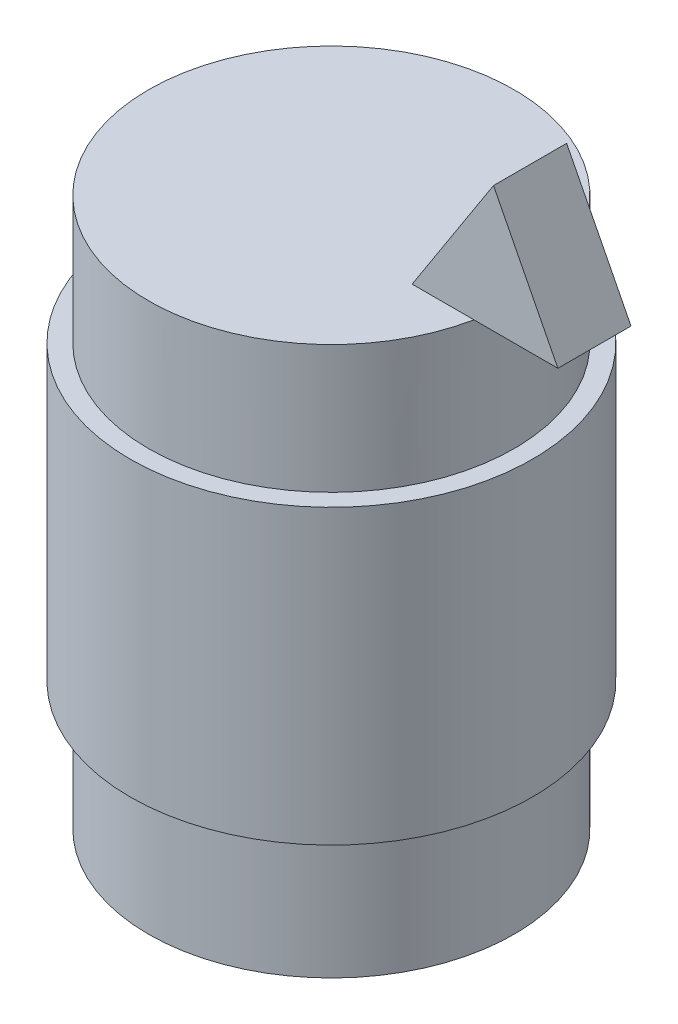
ISO-10303-21;
HEADER;
FILE_DESCRIPTION(('STEP AP214'),'2;1');
FILE_NAME('part.step','',(''),(''),'','','');
FILE_SCHEMA(('AUTOMOTIVE_DESIGN { 1 0 10303 214 1 1 1 1 }'));
ENDSEC;
DATA;
#1=APPLICATION_CONTEXT('core data for automotive mechanical design processes');
#2=APPLICATION_PROTOCOL_DEFINITION('international standard','automotive_design',2000,#1);
#3=PRODUCT_CONTEXT('',#1,'mechanical');
#4=PRODUCT('Part','Part','',(#3));
#5=PRODUCT_RELATED_PRODUCT_CATEGORY('part','',(#4));
#6=PRODUCT_DEFINITION_FORMATION('','',#4);
#7=PRODUCT_DEFINITION_CONTEXT('part definition',#1,'design');
#8=PRODUCT_DEFINITION('design','',#6,#7);
#9=PRODUCT_DEFINITION_SHAPE('','',#8);
#10=(LENGTH_UNIT() NAMED_UNIT(*) SI_UNIT(.MILLI.,.METRE.));
#11=(NAMED_UNIT(*) PLANE_ANGLE_UNIT() SI_UNIT($,.RADIAN.));
#12=(NAMED_UNIT(*) SI_UNIT($,.STERADIAN.) SOLID_ANGLE_UNIT());
#13=UNCERTAINTY_MEASURE_WITH_UNIT(LENGTH_MEASURE(1.E-05),#10,'distance_accuracy_value','');
#14=(GEOMETRIC_REPRESENTATION_CONTEXT(3) GLOBAL_UNCERTAINTY_ASSIGNED_CONTEXT((#13)) GLOBAL_UNIT_ASSIGNED_CONTEXT((#10,
#11,#12)) REPRESENTATION_CONTEXT('',''));
#15=CARTESIAN_POINT('',(0.,0.,0.));
#16=DIRECTION('',(0.,0.,1.));
#17=DIRECTION('',(1.,0.,0.));
#18=AXIS2_PLACEMENT_3D('',#15,#16,#17);
#19=CARTESIAN_POINT('',(-0.0602621023343495,15.6512583067855,0.));
#20=DIRECTION('',(0.,1.,0.));
#21=DIRECTION('',(0.,0.,1.));
#22=AXIS2_PLACEMENT_3D('',#19,#20,#21);
#23=PLANE('',#22);
#24=DIRECTION('',(0.,0.,-1.));
#25=VECTOR('',#24,1.);
#26=CARTESIAN_POINT('',(6.67811524285545,15.6512583067855,2.1));
#27=LINE('',#26,#25);
#28=CARTESIAN_POINT('',(6.67811524285545,15.6512583067855,2.1));
#29=VERTEX_POINT('',#28);
#30=CARTESIAN_POINT('',(6.67811524285545,15.6512583067855,-2.1));
#31=VERTEX_POINT('',#30);
#32=EDGE_CURVE('E93',#29,#31,#27,.T.);
#33=ORIENTED_EDGE('',*,*,#32,.T.);
#34=DIRECTION('',(1.,0.,0.));
#35=VECTOR('',#34,1.);
#36=CARTESIAN_POINT('',(6.67811524285545,15.6512583067855,-2.1));
#37=LINE('',#36,#35);
#38=CARTESIAN_POINT('',(10.227594817355,15.6512583067855,-2.1));
#39=VERTEX_POINT('',#38);
#40=EDGE_CURVE('E109',#31,#39,#37,.T.);
#41=ORIENTED_EDGE('',*,*,#40,.T.);
#42=CARTESIAN_POINT('',(-0.0602621023343495,15.6512583067855,0.));
#43=DIRECTION('',(0.,1.,0.));
#44=DIRECTION('',(0.,0.,1.));
#45=AXIS2_PLACEMENT_3D('',#42,#43,#44);
#46=CIRCLE('',#45,10.5);
#47=CARTESIAN_POINT('',(10.227594817355,15.6512583067855,2.1));
#48=VERTEX_POINT('',#47);
#49=EDGE_CURVE('E101',#39,#48,#46,.T.);
#50=ORIENTED_EDGE('',*,*,#49,.T.);
#51=DIRECTION('',(1.,0.,0.));
#52=VECTOR('',#51,1.);
#53=CARTESIAN_POINT('',(6.67811524285545,15.6512583067855,2.1));
#54=LINE('',#53,#52);
#55=EDGE_CURVE('E85',#29,#48,#54,.T.);
#56=ORIENTED_EDGE('',*,*,#55,.F.);
#57=EDGE_LOOP('',(#33,#41,#50,#56));
#58=FACE_BOUND('',#57,.T.);
#59=ADVANCED_FACE('F39',(#58),#23,.T.);
#60=CARTESIAN_POINT('',(-0.0602621023343495,15.6512583067855,0.));
#61=DIRECTION('',(0.,-1.,0.));
#62=DIRECTION('',(0.,0.,-1.));
#63=AXIS2_PLACEMENT_3D('',#60,#61,#62);
#64=CYLINDRICAL_SURFACE('',#63,10.5);
#65=CARTESIAN_POINT('',(-0.0602621023343495,8.3012583067855,0.));
#66=DIRECTION('',(0.,1.,0.));
#67=DIRECTION('',(0.,0.,1.));
#68=AXIS2_PLACEMENT_3D('',#65,#66,#67);
#69=CIRCLE('',#68,10.5);
#70=CARTESIAN_POINT('',(-0.0602621023343495,8.3012583067855,10.5));
#71=VERTEX_POINT('',#70);
#72=EDGE_CURVE('E43',#71,#71,#69,.T.);
#73=ORIENTED_EDGE('',*,*,#72,.T.);
#74=EDGE_LOOP('',(#73));
#75=FACE_BOUND('',#74,.T.);
#76=EDGE_CURVE('E48',#48,#39,#46,.T.);
#77=ORIENTED_EDGE('',*,*,#76,.F.);
#78=ORIENTED_EDGE('',*,*,#49,.F.);
#79=EDGE_LOOP('',(#77,#78));
#80=FACE_BOUND('',#79,.T.);
#81=ADVANCED_FACE('F41',(#75,#80),#64,.T.);
#82=CARTESIAN_POINT('',(-0.0602621023343495,8.3012583067855,0.));
#83=DIRECTION('',(0.,-1.,0.));
#84=DIRECTION('',(0.,0.,-1.));
#85=AXIS2_PLACEMENT_3D('',#82,#83,#84);
#86=CYLINDRICAL_SURFACE('',#85,11.55);
#87=CARTESIAN_POINT('',(-0.0602621023343495,8.3012583067855,0.));
#88=DIRECTION('',(0.,1.,0.));
#89=DIRECTION('',(0.,0.,1.));
#90=AXIS2_PLACEMENT_3D('',#87,#88,#89);
#91=CIRCLE('',#90,11.55);
#92=CARTESIAN_POINT('',(-0.0602621023343495,8.3012583067855,11.55));
#93=VERTEX_POINT('',#92);
#94=EDGE_CURVE('E115',#93,#93,#91,.T.);
#95=ORIENTED_EDGE('',*,*,#94,.F.);
#96=EDGE_LOOP('',(#95));
#97=FACE_BOUND('',#96,.T.);
#98=CARTESIAN_POINT('',(-0.0602621023343495,-8.4987416932145,0.));
#99=DIRECTION('',(0.,1.,0.));
#100=DIRECTION('',(0.,0.,1.));
#101=AXIS2_PLACEMENT_3D('',#98,#99,#100);
#102=CIRCLE('',#101,11.55);
#103=CARTESIAN_POINT('',(-0.0602621023343495,-8.4987416932145,11.55));
#104=VERTEX_POINT('',#103);
#105=EDGE_CURVE('E97',#104,#104,#102,.T.);
#106=ORIENTED_EDGE('',*,*,#105,.T.);
#107=EDGE_LOOP('',(#106));
#108=FACE_BOUND('',#107,.T.);
#109=ADVANCED_FACE('F134',(#97,#108),#86,.T.);
#110=CARTESIAN_POINT('',(-0.0602621023343495,8.3012583067855,0.));
#111=DIRECTION('',(0.,1.,0.));
#112=DIRECTION('',(0.,0.,1.));
#113=AXIS2_PLACEMENT_3D('',#110,#111,#112);
#114=PLANE('',#113);
#115=ORIENTED_EDGE('',*,*,#72,.F.);
#116=EDGE_LOOP('',(#115));
#117=FACE_BOUND('',#116,.T.);
#118=ORIENTED_EDGE('',*,*,#94,.T.);
#119=EDGE_LOOP('',(#118));
#120=FACE_BOUND('',#119,.T.);
#121=ADVANCED_FACE('F130',(#117,#120),#114,.T.);
#122=CARTESIAN_POINT('',(-0.0602621023343495,-8.4987416932145,0.));
#123=DIRECTION('',(0.,1.,0.));
#124=DIRECTION('',(0.,0.,1.));
#125=AXIS2_PLACEMENT_3D('',#122,#123,#124);
#126=PLANE('',#125);
#127=CARTESIAN_POINT('',(-0.0602621023343495,-8.4987416932145,0.));
#128=DIRECTION('',(0.,1.,0.));
#129=DIRECTION('',(0.,0.,1.));
#130=AXIS2_PLACEMENT_3D('',#127,#128,#129);
#131=CIRCLE('',#130,10.5);
#132=CARTESIAN_POINT('',(-0.0602621023343495,-8.4987416932145,10.5));
#133=VERTEX_POINT('',#132);
#134=EDGE_CURVE('E11',#133,#133,#131,.T.);
#135=ORIENTED_EDGE('',*,*,#134,.T.);
#136=EDGE_LOOP('',(#135));
#137=FACE_BOUND('',#136,.T.);
#138=ORIENTED_EDGE('',*,*,#105,.F.);
#139=EDGE_LOOP('',(#138));
#140=FACE_BOUND('',#139,.T.);
#141=ADVANCED_FACE('F133',(#137,#140),#126,.F.);
#142=CARTESIAN_POINT('',(-0.0602621023343495,-15.8487416932145,0.));
#143=DIRECTION('',(0.,1.,0.));
#144=DIRECTION('',(0.,0.,1.));
#145=AXIS2_PLACEMENT_3D('',#142,#143,#144);
#146=PLANE('',#145);
#147=CARTESIAN_POINT('',(-0.0602621023343495,-15.8487416932145,0.));
#148=DIRECTION('',(0.,1.,0.));
#149=DIRECTION('',(0.,0.,1.));
#150=AXIS2_PLACEMENT_3D('',#147,#148,#149);
#151=CIRCLE('',#150,10.5);
#152=CARTESIAN_POINT('',(-0.0602621023343495,-15.8487416932145,10.5));
#153=VERTEX_POINT('',#152);
#154=EDGE_CURVE('E121',#153,#153,#151,.T.);
#155=ORIENTED_EDGE('',*,*,#154,.F.);
#156=EDGE_LOOP('',(#155));
#157=FACE_BOUND('',#156,.T.);
#158=ADVANCED_FACE('F144',(#157),#146,.F.);
#159=ORIENTED_EDGE('',*,*,#154,.T.);
#160=EDGE_LOOP('',(#159));
#161=FACE_BOUND('',#160,.T.);
#162=ORIENTED_EDGE('',*,*,#134,.F.);
#163=EDGE_LOOP('',(#162));
#164=FACE_BOUND('',#163,.T.);
#165=ADVANCED_FACE('F150',(#161,#164),#64,.T.);
#166=CARTESIAN_POINT('',(6.67811524285545,15.6512583067855,2.1));
#167=DIRECTION('',(0.,1.,0.));
#168=DIRECTION('',(0.,0.,1.));
#169=AXIS2_PLACEMENT_3D('',#166,#167,#168);
#170=PLANE('',#169);
#171=CARTESIAN_POINT('',(15.0464966211965,15.6512583067855,2.1));
#172=VERTEX_POINT('',#171);
#173=EDGE_CURVE('E63',#48,#172,#54,.T.);
#174=ORIENTED_EDGE('',*,*,#173,.F.);
#175=ORIENTED_EDGE('',*,*,#76,.T.);
#176=CARTESIAN_POINT('',(15.0464966211965,15.6512583067855,-2.1));
#177=VERTEX_POINT('',#176);
#178=EDGE_CURVE('E108',#39,#177,#37,.T.);
#179=ORIENTED_EDGE('',*,*,#178,.T.);
#180=DIRECTION('',(0.,0.,-1.));
#181=VECTOR('',#180,1.);
#182=CARTESIAN_POINT('',(15.0464966211965,15.6512583067855,2.1));
#183=LINE('',#182,#181);
#184=EDGE_CURVE('E98',#172,#177,#183,.T.);
#185=ORIENTED_EDGE('',*,*,#184,.F.);
#186=EDGE_LOOP('',(#174,#175,#179,#185));
#187=FACE_BOUND('',#186,.T.);
#188=ADVANCED_FACE('F160',(#187),#170,.F.);
#189=CARTESIAN_POINT('',(11.3499371777564,22.8913606025704,2.1));
#190=DIRECTION('',(0.840254974733743,-0.542191458283139,0.));
#191=DIRECTION('',(0.542191458283139,0.840254974733743,0.));
#192=AXIS2_PLACEMENT_3D('',#189,#190,#191);
#193=PLANE('',#192);
#194=DIRECTION('',(-0.542191458283139,-0.840254974733743,0.));
#195=VECTOR('',#194,1.);
#196=CARTESIAN_POINT('',(11.3499371777564,22.8913606025704,-2.1));
#197=LINE('',#196,#195);
#198=CARTESIAN_POINT('',(11.3499371777564,22.8913606025704,-2.1));
#199=VERTEX_POINT('',#198);
#200=EDGE_CURVE('E55',#199,#31,#197,.T.);
#201=ORIENTED_EDGE('',*,*,#200,.T.);
#202=ORIENTED_EDGE('',*,*,#32,.F.);
#203=DIRECTION('',(-0.542191458283139,-0.840254974733743,0.));
#204=VECTOR('',#203,1.);
#205=CARTESIAN_POINT('',(11.3499371777564,22.8913606025704,2.1));
#206=LINE('',#205,#204);
#207=CARTESIAN_POINT('',(11.3499371777564,22.8913606025704,2.1));
#208=VERTEX_POINT('',#207);
#209=EDGE_CURVE('E82',#208,#29,#206,.T.);
#210=ORIENTED_EDGE('',*,*,#209,.F.);
#211=DIRECTION('',(0.,0.,-1.));
#212=VECTOR('',#211,1.);
#213=CARTESIAN_POINT('',(11.3499371777564,22.8913606025704,2.1));
#214=LINE('',#213,#212);
#215=EDGE_CURVE('E104',#208,#199,#214,.T.);
#216=ORIENTED_EDGE('',*,*,#215,.T.);
#217=EDGE_LOOP('',(#201,#202,#210,#216));
#218=FACE_BOUND('',#217,.T.);
#219=ADVANCED_FACE('F94',(#218),#193,.F.);
#220=CARTESIAN_POINT('',(15.0464966211965,15.6512583067855,2.1));
#221=DIRECTION('',(-0.890630876387137,-0.454726997247668,0.));
#222=DIRECTION('',(0.454726997247668,-0.890630876387137,0.));
#223=AXIS2_PLACEMENT_3D('',#220,#221,#222);
#224=PLANE('',#223);
#225=DIRECTION('',(-0.454726997247668,0.890630876387137,0.));
#226=VECTOR('',#225,1.);
#227=CARTESIAN_POINT('',(15.0464966211965,15.6512583067855,-2.1));
#228=LINE('',#227,#226);
#229=EDGE_CURVE('E90',#177,#199,#228,.T.);
#230=ORIENTED_EDGE('',*,*,#229,.T.);
#231=ORIENTED_EDGE('',*,*,#215,.F.);
#232=DIRECTION('',(-0.454726997247668,0.890630876387137,0.));
#233=VECTOR('',#232,1.);
#234=CARTESIAN_POINT('',(15.0464966211965,15.6512583067855,2.1));
#235=LINE('',#234,#233);
#236=EDGE_CURVE('E88',#172,#208,#235,.T.);
#237=ORIENTED_EDGE('',*,*,#236,.F.);
#238=ORIENTED_EDGE('',*,*,#184,.T.);
#239=EDGE_LOOP('',(#230,#231,#237,#238));
#240=FACE_BOUND('',#239,.T.);
#241=ADVANCED_FACE('F170',(#240),#224,.F.);
#242=CARTESIAN_POINT('',(-0.0602621023343495,-0.0987416932145004,2.1));
#243=DIRECTION('',(0.,0.,-1.));
#244=DIRECTION('',(-1.,0.,0.));
#245=AXIS2_PLACEMENT_3D('',#242,#243,#244);
#246=PLANE('',#245);
#247=ORIENTED_EDGE('',*,*,#209,.T.);
#248=ORIENTED_EDGE('',*,*,#55,.T.);
#249=ORIENTED_EDGE('',*,*,#173,.T.);
#250=ORIENTED_EDGE('',*,*,#236,.T.);
#251=EDGE_LOOP('',(#247,#248,#249,#250));
#252=FACE_BOUND('',#251,.T.);
#253=ADVANCED_FACE('F83',(#252),#246,.F.);
#254=CARTESIAN_POINT('',(-0.0602621023343495,-0.0987416932145004,-2.1));
#255=DIRECTION('',(0.,0.,-1.));
#256=DIRECTION('',(-1.,0.,0.));
#257=AXIS2_PLACEMENT_3D('',#254,#255,#256);
#258=PLANE('',#257);
#259=ORIENTED_EDGE('',*,*,#200,.F.);
#260=ORIENTED_EDGE('',*,*,#229,.F.);
#261=ORIENTED_EDGE('',*,*,#178,.F.);
#262=ORIENTED_EDGE('',*,*,#40,.F.);
#263=EDGE_LOOP('',(#259,#260,#261,#262));
#264=FACE_BOUND('',#263,.T.);
#265=ADVANCED_FACE('F176',(#264),#258,.T.);
#266=CLOSED_SHELL('',(#59,#81,#109,#121,#141,#158,#165,#188,#219,#241,#253,#265));
#267=MANIFOLD_SOLID_BREP('B2',#266);
#268=ADVANCED_BREP_SHAPE_REPRESENTATION('',(#18,#267),#14);
#269=SHAPE_DEFINITION_REPRESENTATION(#9,#268);
ENDSEC;
END-ISO-10303-21;
